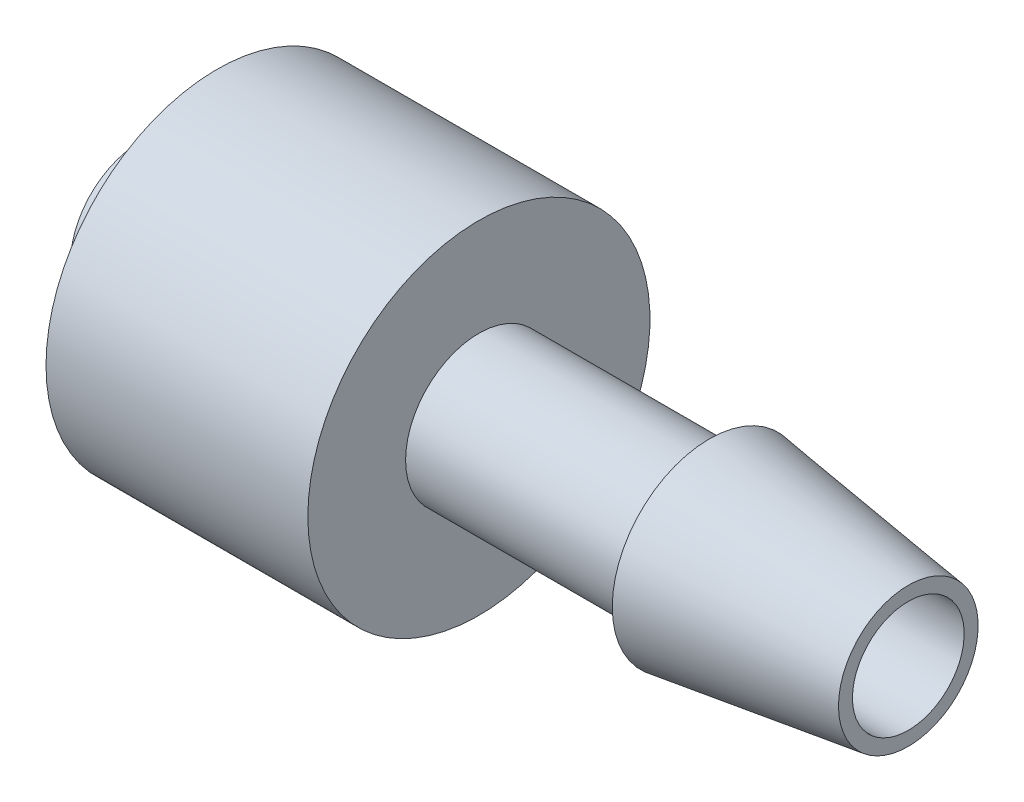
ISO-10303-21;
HEADER;
FILE_DESCRIPTION(('STEP AP214'),'2;1');
FILE_NAME('part.step','',(''),(''),'','','');
FILE_SCHEMA(('AUTOMOTIVE_DESIGN { 1 0 10303 214 1 1 1 1 }'));
ENDSEC;
DATA;
#1=APPLICATION_CONTEXT('core data for automotive mechanical design processes');
#2=APPLICATION_PROTOCOL_DEFINITION('international standard','automotive_design',2000,#1);
#3=PRODUCT_CONTEXT('',#1,'mechanical');
#4=PRODUCT('Part','Part','',(#3));
#5=PRODUCT_RELATED_PRODUCT_CATEGORY('part','',(#4));
#6=PRODUCT_DEFINITION_FORMATION('','',#4);
#7=PRODUCT_DEFINITION_CONTEXT('part definition',#1,'design');
#8=PRODUCT_DEFINITION('design','',#6,#7);
#9=PRODUCT_DEFINITION_SHAPE('','',#8);
#10=(LENGTH_UNIT() NAMED_UNIT(*) SI_UNIT(.MILLI.,.METRE.));
#11=(NAMED_UNIT(*) PLANE_ANGLE_UNIT() SI_UNIT($,.RADIAN.));
#12=(NAMED_UNIT(*) SI_UNIT($,.STERADIAN.) SOLID_ANGLE_UNIT());
#13=UNCERTAINTY_MEASURE_WITH_UNIT(LENGTH_MEASURE(1.E-05),#10,'distance_accuracy_value','');
#14=(GEOMETRIC_REPRESENTATION_CONTEXT(3) GLOBAL_UNCERTAINTY_ASSIGNED_CONTEXT((#13)) GLOBAL_UNIT_ASSIGNED_CONTEXT((#10,
#11,#12)) REPRESENTATION_CONTEXT('',''));
#15=CARTESIAN_POINT('',(0.,0.,0.));
#16=DIRECTION('',(0.,0.,1.));
#17=DIRECTION('',(1.,0.,0.));
#18=AXIS2_PLACEMENT_3D('',#15,#16,#17);
#19=CARTESIAN_POINT('',(-12.9613619192621,0.,0.));
#20=DIRECTION('',(-1.,0.,0.));
#21=DIRECTION('',(0.,0.,1.));
#22=AXIS2_PLACEMENT_3D('',#19,#20,#21);
#23=PLANE('',#22);
#24=CARTESIAN_POINT('',(-12.9613619192621,-1.6,0.));
#25=DIRECTION('',(-1.,0.,0.));
#26=DIRECTION('',(0.,0.,1.));
#27=AXIS2_PLACEMENT_3D('',#24,#25,#26);
#28=CIRCLE('',#27,4.);
#29=CARTESIAN_POINT('',(-12.9613619192621,-1.6,4.));
#30=VERTEX_POINT('',#29);
#31=EDGE_CURVE('E100',#30,#30,#28,.T.);
#32=ORIENTED_EDGE('',*,*,#31,.T.);
#33=EDGE_LOOP('',(#32));
#34=FACE_BOUND('',#33,.T.);
#35=CARTESIAN_POINT('',(-12.9613619192621,-1.6,0.));
#36=DIRECTION('',(-1.,0.,0.));
#37=DIRECTION('',(0.,0.,1.));
#38=AXIS2_PLACEMENT_3D('',#35,#36,#37);
#39=CIRCLE('',#38,2.);
#40=CARTESIAN_POINT('',(-12.9613619192621,-1.6,2.));
#41=VERTEX_POINT('',#40);
#42=EDGE_CURVE('E10',#41,#41,#39,.T.);
#43=ORIENTED_EDGE('',*,*,#42,.F.);
#44=EDGE_LOOP('',(#43));
#45=FACE_BOUND('',#44,.T.);
#46=ADVANCED_FACE('F41',(#34,#45),#23,.T.);
#47=CARTESIAN_POINT('',(-25.581495943886,-1.6,0.));
#48=DIRECTION('',(-1.,0.,0.));
#49=DIRECTION('',(0.,0.,1.));
#50=AXIS2_PLACEMENT_3D('',#47,#48,#49);
#51=CYLINDRICAL_SURFACE('',#50,2.);
#52=ORIENTED_EDGE('',*,*,#42,.T.);
#53=EDGE_LOOP('',(#52));
#54=FACE_BOUND('',#53,.T.);
#55=CARTESIAN_POINT('',(-21.5613619192621,-1.6,0.));
#56=DIRECTION('',(-1.,0.,0.));
#57=DIRECTION('',(0.,0.,1.));
#58=AXIS2_PLACEMENT_3D('',#55,#56,#57);
#59=CIRCLE('',#58,2.);
#60=CARTESIAN_POINT('',(-21.5613619192621,-1.6,2.));
#61=VERTEX_POINT('',#60);
#62=EDGE_CURVE('E48',#61,#61,#59,.T.);
#63=ORIENTED_EDGE('',*,*,#62,.F.);
#64=EDGE_LOOP('',(#63));
#65=FACE_BOUND('',#64,.T.);
#66=ADVANCED_FACE('F119',(#54,#65),#51,.T.);
#67=CARTESIAN_POINT('',(-21.5613619192621,0.,0.));
#68=DIRECTION('',(-1.,0.,0.));
#69=DIRECTION('',(0.,0.,1.));
#70=AXIS2_PLACEMENT_3D('',#67,#68,#69);
#71=PLANE('',#70);
#72=ORIENTED_EDGE('',*,*,#62,.T.);
#73=EDGE_LOOP('',(#72));
#74=FACE_BOUND('',#73,.T.);
#75=CARTESIAN_POINT('',(-21.5613619192621,-1.6,0.));
#76=DIRECTION('',(-1.,0.,0.));
#77=DIRECTION('',(0.,0.,1.));
#78=AXIS2_PLACEMENT_3D('',#75,#76,#77);
#79=CIRCLE('',#78,1.5);
#80=CARTESIAN_POINT('',(-21.5613619192621,-1.6,1.5));
#81=VERTEX_POINT('',#80);
#82=EDGE_CURVE('E53',#81,#81,#79,.T.);
#83=ORIENTED_EDGE('',*,*,#82,.F.);
#84=EDGE_LOOP('',(#83));
#85=FACE_BOUND('',#84,.T.);
#86=ADVANCED_FACE('F123',(#74,#85),#71,.T.);
#87=CARTESIAN_POINT('',(-25.581495943886,-1.6,0.));
#88=DIRECTION('',(-1.,0.,0.));
#89=DIRECTION('',(0.,0.,1.));
#90=AXIS2_PLACEMENT_3D('',#87,#88,#89);
#91=CYLINDRICAL_SURFACE('',#90,1.5);
#92=ORIENTED_EDGE('',*,*,#82,.T.);
#93=EDGE_LOOP('',(#92));
#94=FACE_BOUND('',#93,.T.);
#95=CARTESIAN_POINT('',(-11.8613619192621,-1.6,0.));
#96=DIRECTION('',(-1.,0.,0.));
#97=DIRECTION('',(0.,0.,1.));
#98=AXIS2_PLACEMENT_3D('',#95,#96,#97);
#99=CIRCLE('',#98,1.5);
#100=CARTESIAN_POINT('',(-11.8613619192621,-1.6,1.5));
#101=VERTEX_POINT('',#100);
#102=EDGE_CURVE('E58',#101,#101,#99,.T.);
#103=ORIENTED_EDGE('',*,*,#102,.F.);
#104=EDGE_LOOP('',(#103));
#105=FACE_BOUND('',#104,.T.);
#106=ADVANCED_FACE('F127',(#94,#105),#91,.F.);
#107=CARTESIAN_POINT('',(-11.8613619192621,-2.05761829784012E-13,0.));
#108=DIRECTION('',(1.,0.,0.));
#109=DIRECTION('',(0.,0.,-1.));
#110=AXIS2_PLACEMENT_3D('',#107,#108,#109);
#111=PLANE('',#110);
#112=ORIENTED_EDGE('',*,*,#102,.T.);
#113=EDGE_LOOP('',(#112));
#114=FACE_BOUND('',#113,.T.);
#115=CARTESIAN_POINT('',(-11.8613619192621,-1.6,0.));
#116=DIRECTION('',(-1.,0.,0.));
#117=DIRECTION('',(0.,0.,1.));
#118=AXIS2_PLACEMENT_3D('',#115,#116,#117);
#119=CIRCLE('',#118,1.6);
#120=CARTESIAN_POINT('',(-11.8613619192621,-1.6,1.6));
#121=VERTEX_POINT('',#120);
#122=EDGE_CURVE('E64',#121,#121,#119,.T.);
#123=ORIENTED_EDGE('',*,*,#122,.F.);
#124=EDGE_LOOP('',(#123));
#125=FACE_BOUND('',#124,.T.);
#126=ADVANCED_FACE('F133',(#114,#125),#111,.T.);
#127=CARTESIAN_POINT('',(-25.581495943886,-1.6,0.));
#128=DIRECTION('',(-1.,0.,0.));
#129=DIRECTION('',(0.,0.,1.));
#130=AXIS2_PLACEMENT_3D('',#127,#128,#129);
#131=CYLINDRICAL_SURFACE('',#130,1.6);
#132=CARTESIAN_POINT('',(0.438638080737942,-1.6,0.));
#133=DIRECTION('',(-1.,0.,0.));
#134=DIRECTION('',(0.,0.,1.));
#135=AXIS2_PLACEMENT_3D('',#132,#133,#134);
#136=CIRCLE('',#135,1.6);
#137=CARTESIAN_POINT('',(0.438638080737942,-1.6,1.6));
#138=VERTEX_POINT('',#137);
#139=EDGE_CURVE('E68',#138,#138,#136,.T.);
#140=ORIENTED_EDGE('',*,*,#139,.F.);
#141=EDGE_LOOP('',(#140));
#142=FACE_BOUND('',#141,.T.);
#143=ORIENTED_EDGE('',*,*,#122,.T.);
#144=EDGE_LOOP('',(#143));
#145=FACE_BOUND('',#144,.T.);
#146=ADVANCED_FACE('F137',(#142,#145),#131,.F.);
#147=CARTESIAN_POINT('',(0.438638080737943,0.,0.));
#148=DIRECTION('',(1.,0.,0.));
#149=DIRECTION('',(0.,0.,-1.));
#150=AXIS2_PLACEMENT_3D('',#147,#148,#149);
#151=PLANE('',#150);
#152=ORIENTED_EDGE('',*,*,#139,.T.);
#153=EDGE_LOOP('',(#152));
#154=FACE_BOUND('',#153,.T.);
#155=CARTESIAN_POINT('',(0.438638080737942,-1.6,0.));
#156=DIRECTION('',(-1.,0.,0.));
#157=DIRECTION('',(0.,0.,1.));
#158=AXIS2_PLACEMENT_3D('',#155,#156,#157);
#159=CIRCLE('',#158,2.);
#160=CARTESIAN_POINT('',(0.438638080737942,-1.6,2.));
#161=VERTEX_POINT('',#160);
#162=EDGE_CURVE('E72',#161,#161,#159,.T.);
#163=ORIENTED_EDGE('',*,*,#162,.F.);
#164=EDGE_LOOP('',(#163));
#165=FACE_BOUND('',#164,.T.);
#166=ADVANCED_FACE('F141',(#154,#165),#151,.T.);
#167=CARTESIAN_POINT('',(0.438638080737942,-1.6,0.));
#168=DIRECTION('',(-1.,0.,0.));
#169=DIRECTION('',(0.,0.,1.));
#170=AXIS2_PLACEMENT_3D('',#167,#168,#169);
#171=CONICAL_SURFACE('',#170,2.,0.135997418037384);
#172=CARTESIAN_POINT('',(-5.26136191926205,-1.6,0.));
#173=DIRECTION('',(-1.,0.,0.));
#174=DIRECTION('',(0.,0.,1.));
#175=AXIS2_PLACEMENT_3D('',#172,#173,#174);
#176=CIRCLE('',#175,2.78);
#177=CARTESIAN_POINT('',(-5.26136191926205,-1.6,2.78));
#178=VERTEX_POINT('',#177);
#179=EDGE_CURVE('E76',#178,#178,#176,.T.);
#180=ORIENTED_EDGE('',*,*,#179,.F.);
#181=EDGE_LOOP('',(#180));
#182=FACE_BOUND('',#181,.T.);
#183=ORIENTED_EDGE('',*,*,#162,.T.);
#184=EDGE_LOOP('',(#183));
#185=FACE_BOUND('',#184,.T.);
#186=ADVANCED_FACE('F145',(#182,#185),#171,.T.);
#187=CARTESIAN_POINT('',(-5.26136191926206,0.,0.));
#188=DIRECTION('',(1.,0.,0.));
#189=DIRECTION('',(0.,0.,-1.));
#190=AXIS2_PLACEMENT_3D('',#187,#188,#189);
#191=PLANE('',#190);
#192=CARTESIAN_POINT('',(-5.26136191926205,-1.6,0.));
#193=DIRECTION('',(-1.,0.,0.));
#194=DIRECTION('',(0.,0.,1.));
#195=AXIS2_PLACEMENT_3D('',#192,#193,#194);
#196=CIRCLE('',#195,2.1);
#197=CARTESIAN_POINT('',(-5.26136191926205,-1.6,2.1));
#198=VERTEX_POINT('',#197);
#199=EDGE_CURVE('E80',#198,#198,#196,.T.);
#200=ORIENTED_EDGE('',*,*,#199,.F.);
#201=EDGE_LOOP('',(#200));
#202=FACE_BOUND('',#201,.T.);
#203=ORIENTED_EDGE('',*,*,#179,.T.);
#204=EDGE_LOOP('',(#203));
#205=FACE_BOUND('',#204,.T.);
#206=ADVANCED_FACE('F149',(#202,#205),#191,.F.);
#207=CARTESIAN_POINT('',(-25.581495943886,-1.6,0.));
#208=DIRECTION('',(-1.,0.,0.));
#209=DIRECTION('',(0.,0.,1.));
#210=AXIS2_PLACEMENT_3D('',#207,#208,#209);
#211=CYLINDRICAL_SURFACE('',#210,2.1);
#212=CARTESIAN_POINT('',(-11.8613619192621,-1.6,0.));
#213=DIRECTION('',(-1.,0.,0.));
#214=DIRECTION('',(0.,0.,1.));
#215=AXIS2_PLACEMENT_3D('',#212,#213,#214);
#216=CIRCLE('',#215,2.1);
#217=CARTESIAN_POINT('',(-11.8613619192621,-1.6,2.1));
#218=VERTEX_POINT('',#217);
#219=EDGE_CURVE('E84',#218,#218,#216,.T.);
#220=ORIENTED_EDGE('',*,*,#219,.F.);
#221=EDGE_LOOP('',(#220));
#222=FACE_BOUND('',#221,.T.);
#223=ORIENTED_EDGE('',*,*,#199,.T.);
#224=EDGE_LOOP('',(#223));
#225=FACE_BOUND('',#224,.T.);
#226=ADVANCED_FACE('F153',(#222,#225),#211,.T.);
#227=CARTESIAN_POINT('',(-11.8613619192621,0.,0.));
#228=DIRECTION('',(-1.,0.,0.));
#229=DIRECTION('',(0.,0.,1.));
#230=AXIS2_PLACEMENT_3D('',#227,#228,#229);
#231=PLANE('',#230);
#232=CARTESIAN_POINT('',(-11.8613619192621,-1.6,0.));
#233=DIRECTION('',(-1.,0.,0.));
#234=DIRECTION('',(0.,0.,1.));
#235=AXIS2_PLACEMENT_3D('',#232,#233,#234);
#236=CIRCLE('',#235,4.9);
#237=CARTESIAN_POINT('',(-11.8613619192621,-1.6,4.9));
#238=VERTEX_POINT('',#237);
#239=EDGE_CURVE('E88',#238,#238,#236,.T.);
#240=ORIENTED_EDGE('',*,*,#239,.F.);
#241=EDGE_LOOP('',(#240));
#242=FACE_BOUND('',#241,.T.);
#243=ORIENTED_EDGE('',*,*,#219,.T.);
#244=EDGE_LOOP('',(#243));
#245=FACE_BOUND('',#244,.T.);
#246=ADVANCED_FACE('F157',(#242,#245),#231,.F.);
#247=CARTESIAN_POINT('',(-25.581495943886,-1.6,0.));
#248=DIRECTION('',(-1.,0.,0.));
#249=DIRECTION('',(0.,0.,1.));
#250=AXIS2_PLACEMENT_3D('',#247,#248,#249);
#251=CYLINDRICAL_SURFACE('',#250,4.9);
#252=CARTESIAN_POINT('',(-19.3613619192621,-1.6,0.));
#253=DIRECTION('',(-1.,0.,0.));
#254=DIRECTION('',(0.,0.,1.));
#255=AXIS2_PLACEMENT_3D('',#252,#253,#254);
#256=CIRCLE('',#255,4.9);
#257=CARTESIAN_POINT('',(-19.3613619192621,-1.6,4.9));
#258=VERTEX_POINT('',#257);
#259=EDGE_CURVE('E92',#258,#258,#256,.T.);
#260=ORIENTED_EDGE('',*,*,#259,.F.);
#261=EDGE_LOOP('',(#260));
#262=FACE_BOUND('',#261,.T.);
#263=ORIENTED_EDGE('',*,*,#239,.T.);
#264=EDGE_LOOP('',(#263));
#265=FACE_BOUND('',#264,.T.);
#266=ADVANCED_FACE('F115',(#262,#265),#251,.T.);
#267=CARTESIAN_POINT('',(-19.3613619192621,0.,0.));
#268=DIRECTION('',(1.,0.,0.));
#269=DIRECTION('',(0.,0.,-1.));
#270=AXIS2_PLACEMENT_3D('',#267,#268,#269);
#271=PLANE('',#270);
#272=CARTESIAN_POINT('',(-19.3613619192621,-1.6,0.));
#273=DIRECTION('',(-1.,0.,0.));
#274=DIRECTION('',(0.,0.,1.));
#275=AXIS2_PLACEMENT_3D('',#272,#273,#274);
#276=CIRCLE('',#275,4.);
#277=CARTESIAN_POINT('',(-19.3613619192621,-1.6,4.));
#278=VERTEX_POINT('',#277);
#279=EDGE_CURVE('E96',#278,#278,#276,.T.);
#280=ORIENTED_EDGE('',*,*,#279,.F.);
#281=EDGE_LOOP('',(#280));
#282=FACE_BOUND('',#281,.T.);
#283=ORIENTED_EDGE('',*,*,#259,.T.);
#284=EDGE_LOOP('',(#283));
#285=FACE_BOUND('',#284,.T.);
#286=ADVANCED_FACE('F109',(#282,#285),#271,.F.);
#287=CARTESIAN_POINT('',(-25.581495943886,-1.6,0.));
#288=DIRECTION('',(-1.,0.,0.));
#289=DIRECTION('',(0.,0.,1.));
#290=AXIS2_PLACEMENT_3D('',#287,#288,#289);
#291=CYLINDRICAL_SURFACE('',#290,4.);
#292=ORIENTED_EDGE('',*,*,#279,.T.);
#293=EDGE_LOOP('',(#292));
#294=FACE_BOUND('',#293,.T.);
#295=ORIENTED_EDGE('',*,*,#31,.F.);
#296=EDGE_LOOP('',(#295));
#297=FACE_BOUND('',#296,.T.);
#298=ADVANCED_FACE('F107',(#294,#297),#291,.F.);
#299=CLOSED_SHELL('',(#46,#66,#86,#106,#126,#146,#166,#186,#206,#226,#246,#266,#286,#298));
#300=MANIFOLD_SOLID_BREP('B2',#299);
#301=ADVANCED_BREP_SHAPE_REPRESENTATION('',(#18,#300),#14);
#302=SHAPE_DEFINITION_REPRESENTATION(#9,#301);
ENDSEC;
END-ISO-10303-21;
